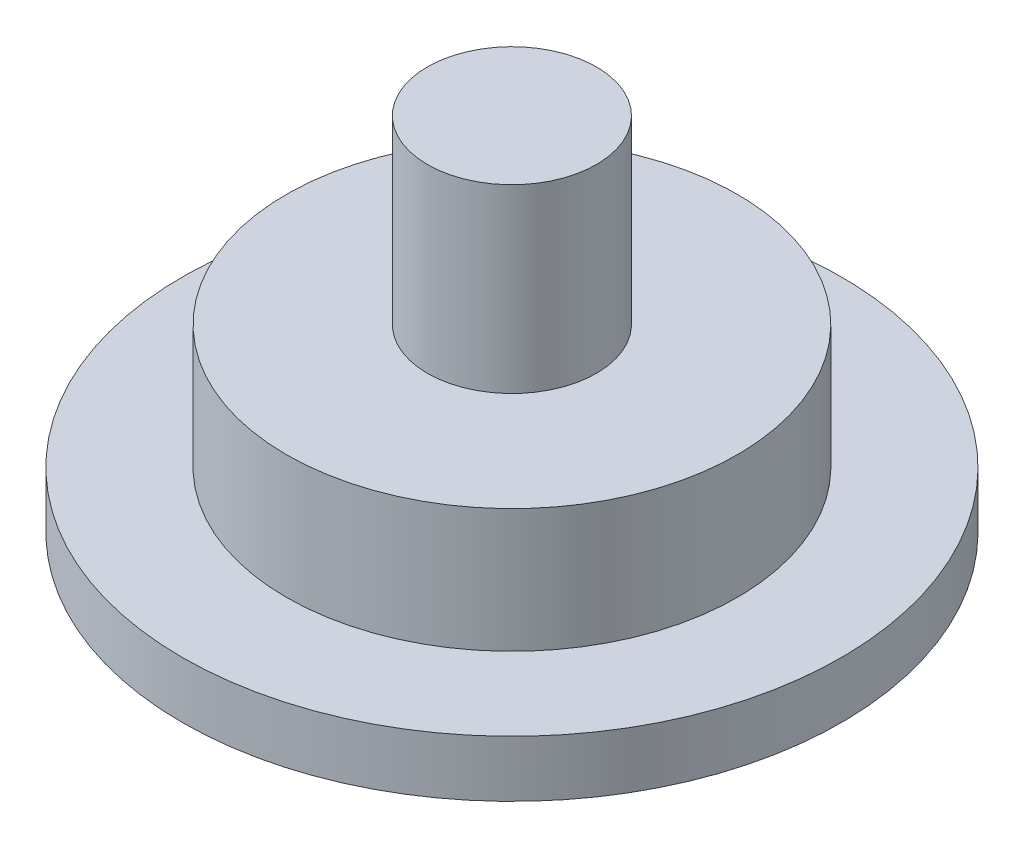
ISO-10303-21;
HEADER;
FILE_DESCRIPTION(('STEP AP214'),'2;1');
FILE_NAME('part.step','',(''),(''),'','','');
FILE_SCHEMA(('AUTOMOTIVE_DESIGN { 1 0 10303 214 1 1 1 1 }'));
ENDSEC;
DATA;
#1=APPLICATION_CONTEXT('core data for automotive mechanical design processes');
#2=APPLICATION_PROTOCOL_DEFINITION('international standard','automotive_design',2000,#1);
#3=PRODUCT_CONTEXT('',#1,'mechanical');
#4=PRODUCT('Part','Part','',(#3));
#5=PRODUCT_RELATED_PRODUCT_CATEGORY('part','',(#4));
#6=PRODUCT_DEFINITION_FORMATION('','',#4);
#7=PRODUCT_DEFINITION_CONTEXT('part definition',#1,'design');
#8=PRODUCT_DEFINITION('design','',#6,#7);
#9=PRODUCT_DEFINITION_SHAPE('','',#8);
#10=(LENGTH_UNIT() NAMED_UNIT(*) SI_UNIT(.MILLI.,.METRE.));
#11=(NAMED_UNIT(*) PLANE_ANGLE_UNIT() SI_UNIT($,.RADIAN.));
#12=(NAMED_UNIT(*) SI_UNIT($,.STERADIAN.) SOLID_ANGLE_UNIT());
#13=UNCERTAINTY_MEASURE_WITH_UNIT(LENGTH_MEASURE(1.E-05),#10,'distance_accuracy_value','');
#14=(GEOMETRIC_REPRESENTATION_CONTEXT(3) GLOBAL_UNCERTAINTY_ASSIGNED_CONTEXT((#13)) GLOBAL_UNIT_ASSIGNED_CONTEXT((#10,
#11,#12)) REPRESENTATION_CONTEXT('',''));
#15=CARTESIAN_POINT('',(0.,0.,0.));
#16=DIRECTION('',(0.,0.,1.));
#17=DIRECTION('',(1.,0.,0.));
#18=AXIS2_PLACEMENT_3D('',#15,#16,#17);
#19=CARTESIAN_POINT('',(0.,1.3,0.));
#20=DIRECTION('',(0.,-1.,0.));
#21=DIRECTION('',(0.,0.,-1.));
#22=AXIS2_PLACEMENT_3D('',#19,#20,#21);
#23=CYLINDRICAL_SURFACE('',#22,7.6);
#24=CARTESIAN_POINT('',(0.,1.3,0.));
#25=DIRECTION('',(0.,1.,0.));
#26=DIRECTION('',(0.,0.,1.));
#27=AXIS2_PLACEMENT_3D('',#24,#25,#26);
#28=CIRCLE('',#27,7.6);
#29=CARTESIAN_POINT('',(0.,1.3,7.6));
#30=VERTEX_POINT('',#29);
#31=EDGE_CURVE('E47',#30,#30,#28,.T.);
#32=ORIENTED_EDGE('',*,*,#31,.F.);
#33=EDGE_LOOP('',(#32));
#34=FACE_BOUND('',#33,.T.);
#35=CARTESIAN_POINT('',(0.,0.,0.));
#36=DIRECTION('',(0.,1.,0.));
#37=DIRECTION('',(0.,0.,1.));
#38=AXIS2_PLACEMENT_3D('',#35,#36,#37);
#39=CIRCLE('',#38,7.6);
#40=CARTESIAN_POINT('',(0.,0.,7.6));
#41=VERTEX_POINT('',#40);
#42=EDGE_CURVE('E38',#41,#41,#39,.T.);
#43=ORIENTED_EDGE('',*,*,#42,.T.);
#44=EDGE_LOOP('',(#43));
#45=FACE_BOUND('',#44,.T.);
#46=ADVANCED_FACE('F35',(#34,#45),#23,.T.);
#47=CARTESIAN_POINT('',(0.,1.3,0.));
#48=DIRECTION('',(0.,1.,0.));
#49=DIRECTION('',(0.,0.,1.));
#50=AXIS2_PLACEMENT_3D('',#47,#48,#49);
#51=PLANE('',#50);
#52=CARTESIAN_POINT('',(0.,1.3,0.));
#53=DIRECTION('',(0.,1.,0.));
#54=DIRECTION('',(0.,0.,1.));
#55=AXIS2_PLACEMENT_3D('',#52,#53,#54);
#56=CIRCLE('',#55,5.2);
#57=CARTESIAN_POINT('',(0.,1.3,5.2));
#58=VERTEX_POINT('',#57);
#59=EDGE_CURVE('E42',#58,#58,#56,.T.);
#60=ORIENTED_EDGE('',*,*,#59,.F.);
#61=EDGE_LOOP('',(#60));
#62=FACE_BOUND('',#61,.T.);
#63=ORIENTED_EDGE('',*,*,#31,.T.);
#64=EDGE_LOOP('',(#63));
#65=FACE_BOUND('',#64,.T.);
#66=ADVANCED_FACE('F65',(#62,#65),#51,.T.);
#67=CARTESIAN_POINT('',(0.,0.,0.));
#68=DIRECTION('',(0.,1.,0.));
#69=DIRECTION('',(0.,0.,1.));
#70=AXIS2_PLACEMENT_3D('',#67,#68,#69);
#71=PLANE('',#70);
#72=CARTESIAN_POINT('',(0.,0.,0.));
#73=DIRECTION('',(0.,-1.,0.));
#74=DIRECTION('',(0.,0.,-1.));
#75=AXIS2_PLACEMENT_3D('',#72,#73,#74);
#76=CIRCLE('',#75,4.4);
#77=CARTESIAN_POINT('',(0.,0.,-4.4));
#78=VERTEX_POINT('',#77);
#79=EDGE_CURVE('E151',#78,#78,#76,.T.);
#80=ORIENTED_EDGE('',*,*,#79,.F.);
#81=EDGE_LOOP('',(#80));
#82=FACE_BOUND('',#81,.T.);
#83=ORIENTED_EDGE('',*,*,#42,.F.);
#84=EDGE_LOOP('',(#83));
#85=FACE_BOUND('',#84,.T.);
#86=ADVANCED_FACE('F62',(#82,#85),#71,.F.);
#87=CARTESIAN_POINT('',(0.,4.15,0.));
#88=DIRECTION('',(0.,-1.,0.));
#89=DIRECTION('',(0.,0.,-1.));
#90=AXIS2_PLACEMENT_3D('',#87,#88,#89);
#91=CYLINDRICAL_SURFACE('',#90,5.2);
#92=CARTESIAN_POINT('',(0.,4.15,0.));
#93=DIRECTION('',(0.,1.,0.));
#94=DIRECTION('',(0.,0.,1.));
#95=AXIS2_PLACEMENT_3D('',#92,#93,#94);
#96=CIRCLE('',#95,5.2);
#97=CARTESIAN_POINT('',(0.,4.15,5.2));
#98=VERTEX_POINT('',#97);
#99=EDGE_CURVE('E53',#98,#98,#96,.T.);
#100=ORIENTED_EDGE('',*,*,#99,.F.);
#101=EDGE_LOOP('',(#100));
#102=FACE_BOUND('',#101,.T.);
#103=ORIENTED_EDGE('',*,*,#59,.T.);
#104=EDGE_LOOP('',(#103));
#105=FACE_BOUND('',#104,.T.);
#106=ADVANCED_FACE('F64',(#102,#105),#91,.T.);
#107=CARTESIAN_POINT('',(0.,4.15,0.));
#108=DIRECTION('',(0.,1.,0.));
#109=DIRECTION('',(0.,0.,1.));
#110=AXIS2_PLACEMENT_3D('',#107,#108,#109);
#111=PLANE('',#110);
#112=CARTESIAN_POINT('',(0.,4.15,0.));
#113=DIRECTION('',(0.,1.,0.));
#114=DIRECTION('',(0.,0.,1.));
#115=AXIS2_PLACEMENT_3D('',#112,#113,#114);
#116=CIRCLE('',#115,1.95);
#117=CARTESIAN_POINT('',(0.,4.15,1.95));
#118=VERTEX_POINT('',#117);
#119=EDGE_CURVE('E10',#118,#118,#116,.T.);
#120=ORIENTED_EDGE('',*,*,#119,.F.);
#121=EDGE_LOOP('',(#120));
#122=FACE_BOUND('',#121,.T.);
#123=ORIENTED_EDGE('',*,*,#99,.T.);
#124=EDGE_LOOP('',(#123));
#125=FACE_BOUND('',#124,.T.);
#126=ADVANCED_FACE('F71',(#122,#125),#111,.T.);
#127=CARTESIAN_POINT('',(0.,8.32,0.));
#128=DIRECTION('',(0.,-1.,0.));
#129=DIRECTION('',(0.,0.,-1.));
#130=AXIS2_PLACEMENT_3D('',#127,#128,#129);
#131=CYLINDRICAL_SURFACE('',#130,1.95);
#132=CARTESIAN_POINT('',(0.,8.32,0.));
#133=DIRECTION('',(0.,1.,0.));
#134=DIRECTION('',(0.,0.,1.));
#135=AXIS2_PLACEMENT_3D('',#132,#133,#134);
#136=CIRCLE('',#135,1.95);
#137=CARTESIAN_POINT('',(0.,8.32,1.95));
#138=VERTEX_POINT('',#137);
#139=EDGE_CURVE('E51',#138,#138,#136,.T.);
#140=ORIENTED_EDGE('',*,*,#139,.F.);
#141=EDGE_LOOP('',(#140));
#142=FACE_BOUND('',#141,.T.);
#143=ORIENTED_EDGE('',*,*,#119,.T.);
#144=EDGE_LOOP('',(#143));
#145=FACE_BOUND('',#144,.T.);
#146=ADVANCED_FACE('F101',(#142,#145),#131,.T.);
#147=CARTESIAN_POINT('',(0.,8.32,0.));
#148=DIRECTION('',(0.,1.,0.));
#149=DIRECTION('',(0.,0.,1.));
#150=AXIS2_PLACEMENT_3D('',#147,#148,#149);
#151=PLANE('',#150);
#152=ORIENTED_EDGE('',*,*,#139,.T.);
#153=EDGE_LOOP('',(#152));
#154=FACE_BOUND('',#153,.T.);
#155=ADVANCED_FACE('F111',(#154),#151,.T.);
#156=CARTESIAN_POINT('',(0.,2.76,0.));
#157=DIRECTION('',(0.,-1.,0.));
#158=DIRECTION('',(0.,0.,-1.));
#159=AXIS2_PLACEMENT_3D('',#156,#157,#158);
#160=CYLINDRICAL_SURFACE('',#159,4.4);
#161=CARTESIAN_POINT('',(0.,2.76,0.));
#162=DIRECTION('',(0.,-1.,0.));
#163=DIRECTION('',(0.,0.,-1.));
#164=AXIS2_PLACEMENT_3D('',#161,#162,#163);
#165=CIRCLE('',#164,4.4);
#166=CARTESIAN_POINT('',(0.,2.76,-4.4));
#167=VERTEX_POINT('',#166);
#168=EDGE_CURVE('E150',#167,#167,#165,.T.);
#169=ORIENTED_EDGE('',*,*,#168,.F.);
#170=EDGE_LOOP('',(#169));
#171=FACE_BOUND('',#170,.T.);
#172=ORIENTED_EDGE('',*,*,#79,.T.);
#173=EDGE_LOOP('',(#172));
#174=FACE_BOUND('',#173,.T.);
#175=ADVANCED_FACE('F120',(#171,#174),#160,.F.);
#176=CARTESIAN_POINT('',(0.,2.76,0.));
#177=DIRECTION('',(0.,-1.,0.));
#178=DIRECTION('',(0.,0.,-1.));
#179=AXIS2_PLACEMENT_3D('',#176,#177,#178);
#180=PLANE('',#179);
#181=ORIENTED_EDGE('',*,*,#168,.T.);
#182=EDGE_LOOP('',(#181));
#183=FACE_BOUND('',#182,.T.);
#184=ADVANCED_FACE('F134',(#183),#180,.T.);
#185=CLOSED_SHELL('',(#46,#66,#86,#106,#126,#146,#155,#175,#184));
#186=MANIFOLD_SOLID_BREP('B2',#185);
#187=ADVANCED_BREP_SHAPE_REPRESENTATION('',(#18,#186),#14);
#188=SHAPE_DEFINITION_REPRESENTATION(#9,#187);
ENDSEC;
END-ISO-10303-21;
